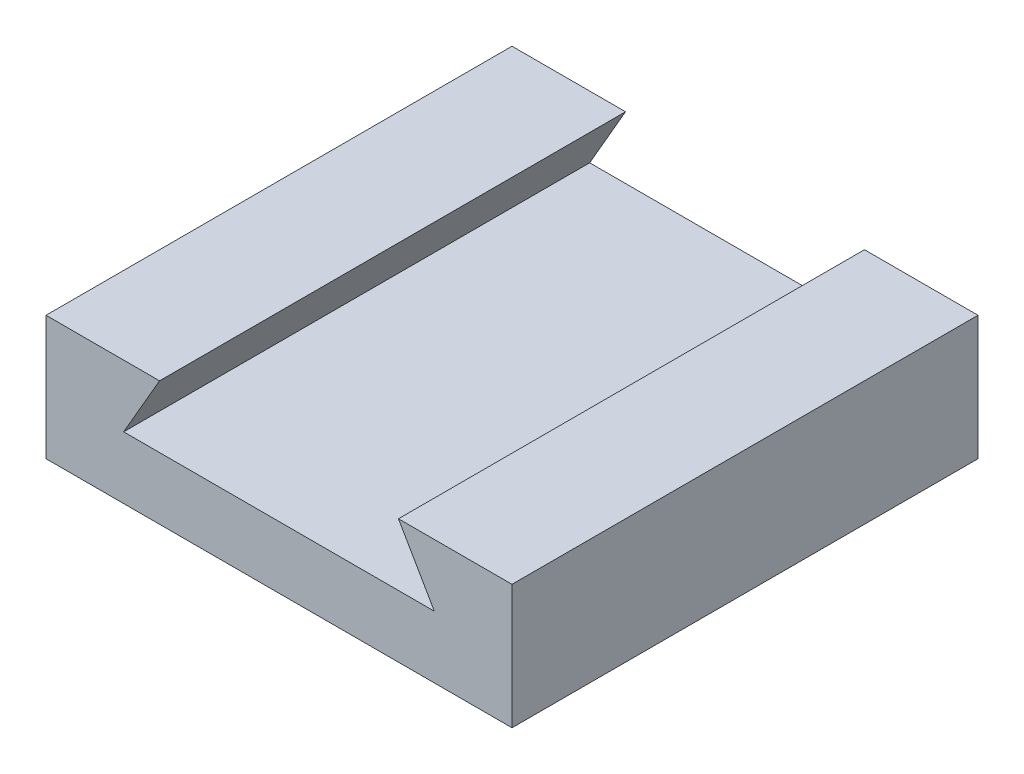
ISO-10303-21;
HEADER;
FILE_DESCRIPTION(('STEP AP214'),'2;1');
FILE_NAME('part.step','',(''),(''),'','','');
FILE_SCHEMA(('AUTOMOTIVE_DESIGN { 1 0 10303 214 1 1 1 1 }'));
ENDSEC;
DATA;
#1=APPLICATION_CONTEXT('core data for automotive mechanical design processes');
#2=APPLICATION_PROTOCOL_DEFINITION('international standard','automotive_design',2000,#1);
#3=PRODUCT_CONTEXT('',#1,'mechanical');
#4=PRODUCT('Part','Part','',(#3));
#5=PRODUCT_RELATED_PRODUCT_CATEGORY('part','',(#4));
#6=PRODUCT_DEFINITION_FORMATION('','',#4);
#7=PRODUCT_DEFINITION_CONTEXT('part definition',#1,'design');
#8=PRODUCT_DEFINITION('design','',#6,#7);
#9=PRODUCT_DEFINITION_SHAPE('','',#8);
#10=(LENGTH_UNIT() NAMED_UNIT(*) SI_UNIT(.MILLI.,.METRE.));
#11=(NAMED_UNIT(*) PLANE_ANGLE_UNIT() SI_UNIT($,.RADIAN.));
#12=(NAMED_UNIT(*) SI_UNIT($,.STERADIAN.) SOLID_ANGLE_UNIT());
#13=UNCERTAINTY_MEASURE_WITH_UNIT(LENGTH_MEASURE(1.E-05),#10,'distance_accuracy_value','');
#14=(GEOMETRIC_REPRESENTATION_CONTEXT(3) GLOBAL_UNCERTAINTY_ASSIGNED_CONTEXT((#13)) GLOBAL_UNIT_ASSIGNED_CONTEXT((#10,
#11,#12)) REPRESENTATION_CONTEXT('',''));
#15=CARTESIAN_POINT('',(0.,0.,0.));
#16=DIRECTION('',(0.,0.,1.));
#17=DIRECTION('',(1.,0.,0.));
#18=AXIS2_PLACEMENT_3D('',#15,#16,#17);
#19=CARTESIAN_POINT('',(0.,8.,30.));
#20=DIRECTION('',(0.,-1.,0.));
#21=DIRECTION('',(0.,0.,-1.));
#22=AXIS2_PLACEMENT_3D('',#19,#20,#21);
#23=PLANE('',#22);
#24=DIRECTION('',(-1.,0.,0.));
#25=VECTOR('',#24,1.);
#26=CARTESIAN_POINT('',(0.,8.,0.));
#27=LINE('',#26,#25);
#28=CARTESIAN_POINT('',(30.,8.,0.));
#29=VERTEX_POINT('',#28);
#30=CARTESIAN_POINT('',(22.6905989232415,8.,0.));
#31=VERTEX_POINT('',#30);
#32=EDGE_CURVE('E130',#29,#31,#27,.T.);
#33=ORIENTED_EDGE('',*,*,#32,.T.);
#34=DIRECTION('',(0.,0.,1.));
#35=VECTOR('',#34,1.);
#36=CARTESIAN_POINT('',(22.6905989232415,8.,0.));
#37=LINE('',#36,#35);
#38=CARTESIAN_POINT('',(22.6905989232415,8.,30.));
#39=VERTEX_POINT('',#38);
#40=EDGE_CURVE('E161',#31,#39,#37,.T.);
#41=ORIENTED_EDGE('',*,*,#40,.T.);
#42=DIRECTION('',(-1.,0.,0.));
#43=VECTOR('',#42,1.);
#44=CARTESIAN_POINT('',(0.,8.,30.));
#45=LINE('',#44,#43);
#46=CARTESIAN_POINT('',(30.,8.,30.));
#47=VERTEX_POINT('',#46);
#48=EDGE_CURVE('E149',#47,#39,#45,.T.);
#49=ORIENTED_EDGE('',*,*,#48,.F.);
#50=DIRECTION('',(0.,0.,-1.));
#51=VECTOR('',#50,1.);
#52=CARTESIAN_POINT('',(30.,8.,30.));
#53=LINE('',#52,#51);
#54=EDGE_CURVE('E43',#47,#29,#53,.T.);
#55=ORIENTED_EDGE('',*,*,#54,.T.);
#56=EDGE_LOOP('',(#33,#41,#49,#55));
#57=FACE_BOUND('',#56,.T.);
#58=ADVANCED_FACE('F35',(#57),#23,.F.);
#59=CARTESIAN_POINT('',(30.,0.,30.));
#60=DIRECTION('',(0.,1.,0.));
#61=DIRECTION('',(-1.,0.,0.));
#62=AXIS2_PLACEMENT_3D('',#59,#60,#61);
#63=PLANE('',#62);
#64=DIRECTION('',(1.,0.,0.));
#65=VECTOR('',#64,1.);
#66=CARTESIAN_POINT('',(30.,0.,0.));
#67=LINE('',#66,#65);
#68=CARTESIAN_POINT('',(0.,0.,0.));
#69=VERTEX_POINT('',#68);
#70=CARTESIAN_POINT('',(30.,0.,0.));
#71=VERTEX_POINT('',#70);
#72=EDGE_CURVE('E134',#69,#71,#67,.T.);
#73=ORIENTED_EDGE('',*,*,#72,.T.);
#74=DIRECTION('',(0.,0.,-1.));
#75=VECTOR('',#74,1.);
#76=CARTESIAN_POINT('',(30.,0.,30.));
#77=LINE('',#76,#75);
#78=CARTESIAN_POINT('',(30.,0.,30.));
#79=VERTEX_POINT('',#78);
#80=EDGE_CURVE('E11',#79,#71,#77,.T.);
#81=ORIENTED_EDGE('',*,*,#80,.F.);
#82=DIRECTION('',(1.,0.,0.));
#83=VECTOR('',#82,1.);
#84=CARTESIAN_POINT('',(30.,0.,30.));
#85=LINE('',#84,#83);
#86=CARTESIAN_POINT('',(0.,0.,30.));
#87=VERTEX_POINT('',#86);
#88=EDGE_CURVE('E139',#87,#79,#85,.T.);
#89=ORIENTED_EDGE('',*,*,#88,.F.);
#90=DIRECTION('',(0.,0.,-1.));
#91=VECTOR('',#90,1.);
#92=CARTESIAN_POINT('',(0.,0.,30.));
#93=LINE('',#92,#91);
#94=EDGE_CURVE('E140',#87,#69,#93,.T.);
#95=ORIENTED_EDGE('',*,*,#94,.T.);
#96=EDGE_LOOP('',(#73,#81,#89,#95));
#97=FACE_BOUND('',#96,.T.);
#98=ADVANCED_FACE('F37',(#97),#63,.F.);
#99=CARTESIAN_POINT('',(30.,8.,30.));
#100=DIRECTION('',(-1.,0.,0.));
#101=DIRECTION('',(0.,-1.,0.));
#102=AXIS2_PLACEMENT_3D('',#99,#100,#101);
#103=PLANE('',#102);
#104=DIRECTION('',(0.,1.,0.));
#105=VECTOR('',#104,1.);
#106=CARTESIAN_POINT('',(30.,8.,0.));
#107=LINE('',#106,#105);
#108=EDGE_CURVE('E131',#71,#29,#107,.T.);
#109=ORIENTED_EDGE('',*,*,#108,.T.);
#110=ORIENTED_EDGE('',*,*,#54,.F.);
#111=DIRECTION('',(0.,1.,0.));
#112=VECTOR('',#111,1.);
#113=CARTESIAN_POINT('',(30.,8.,30.));
#114=LINE('',#113,#112);
#115=EDGE_CURVE('E87',#79,#47,#114,.T.);
#116=ORIENTED_EDGE('',*,*,#115,.F.);
#117=ORIENTED_EDGE('',*,*,#80,.T.);
#118=EDGE_LOOP('',(#109,#110,#116,#117));
#119=FACE_BOUND('',#118,.T.);
#120=ADVANCED_FACE('F182',(#119),#103,.F.);
#121=CARTESIAN_POINT('',(7.30940107675853,8.,30.));
#122=VERTEX_POINT('',#121);
#123=CARTESIAN_POINT('',(0.,8.,30.));
#124=VERTEX_POINT('',#123);
#125=EDGE_CURVE('E124',#122,#124,#45,.T.);
#126=ORIENTED_EDGE('',*,*,#125,.F.);
#127=DIRECTION('',(0.,0.,1.));
#128=VECTOR('',#127,1.);
#129=CARTESIAN_POINT('',(7.30940107675853,8.,0.));
#130=LINE('',#129,#128);
#131=CARTESIAN_POINT('',(7.30940107675853,8.,0.));
#132=VERTEX_POINT('',#131);
#133=EDGE_CURVE('E112',#132,#122,#130,.T.);
#134=ORIENTED_EDGE('',*,*,#133,.F.);
#135=CARTESIAN_POINT('',(0.,8.,0.));
#136=VERTEX_POINT('',#135);
#137=EDGE_CURVE('E123',#132,#136,#27,.T.);
#138=ORIENTED_EDGE('',*,*,#137,.T.);
#139=DIRECTION('',(0.,0.,-1.));
#140=VECTOR('',#139,1.);
#141=CARTESIAN_POINT('',(0.,8.,30.));
#142=LINE('',#141,#140);
#143=EDGE_CURVE('E142',#124,#136,#142,.T.);
#144=ORIENTED_EDGE('',*,*,#143,.F.);
#145=EDGE_LOOP('',(#126,#134,#138,#144));
#146=FACE_BOUND('',#145,.T.);
#147=ADVANCED_FACE('F121',(#146),#23,.F.);
#148=CARTESIAN_POINT('',(0.,0.,30.));
#149=DIRECTION('',(1.,0.,0.));
#150=DIRECTION('',(0.,0.,-1.));
#151=AXIS2_PLACEMENT_3D('',#148,#149,#150);
#152=PLANE('',#151);
#153=DIRECTION('',(0.,-1.,0.));
#154=VECTOR('',#153,1.);
#155=CARTESIAN_POINT('',(0.,0.,0.));
#156=LINE('',#155,#154);
#157=EDGE_CURVE('E80',#136,#69,#156,.T.);
#158=ORIENTED_EDGE('',*,*,#157,.T.);
#159=ORIENTED_EDGE('',*,*,#94,.F.);
#160=DIRECTION('',(0.,-1.,0.));
#161=VECTOR('',#160,1.);
#162=CARTESIAN_POINT('',(0.,0.,30.));
#163=LINE('',#162,#161);
#164=EDGE_CURVE('E59',#124,#87,#163,.T.);
#165=ORIENTED_EDGE('',*,*,#164,.F.);
#166=ORIENTED_EDGE('',*,*,#143,.T.);
#167=EDGE_LOOP('',(#158,#159,#165,#166));
#168=FACE_BOUND('',#167,.T.);
#169=ADVANCED_FACE('F173',(#168),#152,.F.);
#170=CARTESIAN_POINT('',(0.,0.,30.));
#171=DIRECTION('',(0.,0.,-1.));
#172=DIRECTION('',(-1.,0.,0.));
#173=AXIS2_PLACEMENT_3D('',#170,#171,#172);
#174=PLANE('',#173);
#175=ORIENTED_EDGE('',*,*,#48,.T.);
#176=DIRECTION('',(-0.500000000000004,0.866025403784436,0.));
#177=VECTOR('',#176,1.);
#178=CARTESIAN_POINT('',(25.,4.,30.));
#179=LINE('',#178,#177);
#180=CARTESIAN_POINT('',(25.,4.,30.));
#181=VERTEX_POINT('',#180);
#182=EDGE_CURVE('E117',#181,#39,#179,.T.);
#183=ORIENTED_EDGE('',*,*,#182,.F.);
#184=DIRECTION('',(1.,0.,0.));
#185=VECTOR('',#184,1.);
#186=CARTESIAN_POINT('',(5.,4.,30.));
#187=LINE('',#186,#185);
#188=CARTESIAN_POINT('',(5.,4.,30.));
#189=VERTEX_POINT('',#188);
#190=EDGE_CURVE('E157',#189,#181,#187,.T.);
#191=ORIENTED_EDGE('',*,*,#190,.F.);
#192=DIRECTION('',(-0.500000000000004,-0.866025403784436,0.));
#193=VECTOR('',#192,1.);
#194=CARTESIAN_POINT('',(7.30940107675853,8.,30.));
#195=LINE('',#194,#193);
#196=EDGE_CURVE('E155',#122,#189,#195,.T.);
#197=ORIENTED_EDGE('',*,*,#196,.F.);
#198=ORIENTED_EDGE('',*,*,#125,.T.);
#199=ORIENTED_EDGE('',*,*,#164,.T.);
#200=ORIENTED_EDGE('',*,*,#88,.T.);
#201=ORIENTED_EDGE('',*,*,#115,.T.);
#202=EDGE_LOOP('',(#175,#183,#191,#197,#198,#199,#200,#201));
#203=FACE_BOUND('',#202,.T.);
#204=ADVANCED_FACE('F175',(#203),#174,.F.);
#205=CARTESIAN_POINT('',(0.,0.,0.));
#206=DIRECTION('',(0.,0.,-1.));
#207=DIRECTION('',(-1.,0.,0.));
#208=AXIS2_PLACEMENT_3D('',#205,#206,#207);
#209=PLANE('',#208);
#210=DIRECTION('',(-0.500000000000004,0.866025403784436,0.));
#211=VECTOR('',#210,1.);
#212=CARTESIAN_POINT('',(25.,4.,0.));
#213=LINE('',#212,#211);
#214=CARTESIAN_POINT('',(25.,4.,0.));
#215=VERTEX_POINT('',#214);
#216=EDGE_CURVE('E125',#215,#31,#213,.T.);
#217=ORIENTED_EDGE('',*,*,#216,.T.);
#218=ORIENTED_EDGE('',*,*,#32,.F.);
#219=ORIENTED_EDGE('',*,*,#108,.F.);
#220=ORIENTED_EDGE('',*,*,#72,.F.);
#221=ORIENTED_EDGE('',*,*,#157,.F.);
#222=ORIENTED_EDGE('',*,*,#137,.F.);
#223=DIRECTION('',(-0.500000000000004,-0.866025403784436,0.));
#224=VECTOR('',#223,1.);
#225=CARTESIAN_POINT('',(7.30940107675853,8.,0.));
#226=LINE('',#225,#224);
#227=CARTESIAN_POINT('',(5.,4.,0.));
#228=VERTEX_POINT('',#227);
#229=EDGE_CURVE('E108',#132,#228,#226,.T.);
#230=ORIENTED_EDGE('',*,*,#229,.T.);
#231=DIRECTION('',(1.,0.,0.));
#232=VECTOR('',#231,1.);
#233=CARTESIAN_POINT('',(5.,4.,0.));
#234=LINE('',#233,#232);
#235=EDGE_CURVE('E50',#228,#215,#234,.T.);
#236=ORIENTED_EDGE('',*,*,#235,.T.);
#237=EDGE_LOOP('',(#217,#218,#219,#220,#221,#222,#230,#236));
#238=FACE_BOUND('',#237,.T.);
#239=ADVANCED_FACE('F128',(#238),#209,.T.);
#240=CARTESIAN_POINT('',(25.,4.,0.));
#241=DIRECTION('',(0.866025403784436,0.500000000000004,0.));
#242=DIRECTION('',(-0.500000000000004,0.866025403784436,0.));
#243=AXIS2_PLACEMENT_3D('',#240,#241,#242);
#244=PLANE('',#243);
#245=ORIENTED_EDGE('',*,*,#182,.T.);
#246=ORIENTED_EDGE('',*,*,#40,.F.);
#247=ORIENTED_EDGE('',*,*,#216,.F.);
#248=DIRECTION('',(0.,0.,1.));
#249=VECTOR('',#248,1.);
#250=CARTESIAN_POINT('',(25.,4.,0.));
#251=LINE('',#250,#249);
#252=EDGE_CURVE('E163',#215,#181,#251,.T.);
#253=ORIENTED_EDGE('',*,*,#252,.T.);
#254=EDGE_LOOP('',(#245,#246,#247,#253));
#255=FACE_BOUND('',#254,.T.);
#256=ADVANCED_FACE('F216',(#255),#244,.F.);
#257=CARTESIAN_POINT('',(5.,4.,0.));
#258=DIRECTION('',(0.,-1.,0.));
#259=DIRECTION('',(0.,0.,-1.));
#260=AXIS2_PLACEMENT_3D('',#257,#258,#259);
#261=PLANE('',#260);
#262=ORIENTED_EDGE('',*,*,#190,.T.);
#263=ORIENTED_EDGE('',*,*,#252,.F.);
#264=ORIENTED_EDGE('',*,*,#235,.F.);
#265=DIRECTION('',(0.,0.,1.));
#266=VECTOR('',#265,1.);
#267=CARTESIAN_POINT('',(5.,4.,0.));
#268=LINE('',#267,#266);
#269=EDGE_CURVE('E114',#228,#189,#268,.T.);
#270=ORIENTED_EDGE('',*,*,#269,.T.);
#271=EDGE_LOOP('',(#262,#263,#264,#270));
#272=FACE_BOUND('',#271,.T.);
#273=ADVANCED_FACE('F224',(#272),#261,.F.);
#274=CARTESIAN_POINT('',(7.30940107675853,8.,0.));
#275=DIRECTION('',(-0.866025403784436,0.500000000000004,0.));
#276=DIRECTION('',(-0.500000000000004,-0.866025403784436,0.));
#277=AXIS2_PLACEMENT_3D('',#274,#275,#276);
#278=PLANE('',#277);
#279=ORIENTED_EDGE('',*,*,#196,.T.);
#280=ORIENTED_EDGE('',*,*,#269,.F.);
#281=ORIENTED_EDGE('',*,*,#229,.F.);
#282=ORIENTED_EDGE('',*,*,#133,.T.);
#283=EDGE_LOOP('',(#279,#280,#281,#282));
#284=FACE_BOUND('',#283,.T.);
#285=ADVANCED_FACE('F111',(#284),#278,.F.);
#286=CLOSED_SHELL('',(#58,#98,#120,#147,#169,#204,#239,#256,#273,#285));
#287=MANIFOLD_SOLID_BREP('B2',#286);
#288=ADVANCED_BREP_SHAPE_REPRESENTATION('',(#18,#287),#14);
#289=SHAPE_DEFINITION_REPRESENTATION(#9,#288);
ENDSEC;
END-ISO-10303-21;
